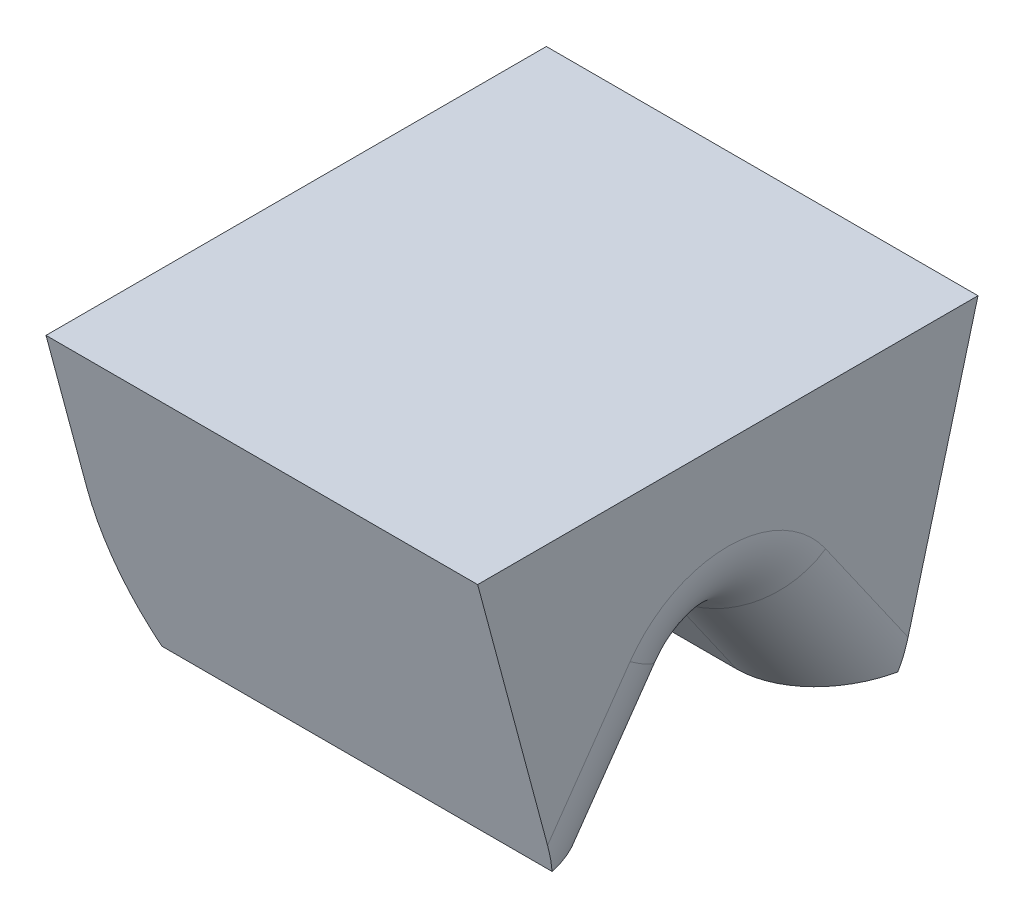
ISO-10303-21;
HEADER;
FILE_DESCRIPTION(('STEP AP214'),'2;1');
FILE_NAME('part.step','',(''),(''),'','','');
FILE_SCHEMA(('AUTOMOTIVE_DESIGN { 1 0 10303 214 1 1 1 1 }'));
ENDSEC;
DATA;
#1=APPLICATION_CONTEXT('core data for automotive mechanical design processes');
#2=APPLICATION_PROTOCOL_DEFINITION('international standard','automotive_design',2000,#1);
#3=PRODUCT_CONTEXT('',#1,'mechanical');
#4=PRODUCT('Part','Part','',(#3));
#5=PRODUCT_RELATED_PRODUCT_CATEGORY('part','',(#4));
#6=PRODUCT_DEFINITION_FORMATION('','',#4);
#7=PRODUCT_DEFINITION_CONTEXT('part definition',#1,'design');
#8=PRODUCT_DEFINITION('design','',#6,#7);
#9=PRODUCT_DEFINITION_SHAPE('','',#8);
#10=(LENGTH_UNIT() NAMED_UNIT(*) SI_UNIT(.MILLI.,.METRE.));
#11=(NAMED_UNIT(*) PLANE_ANGLE_UNIT() SI_UNIT($,.RADIAN.));
#12=(NAMED_UNIT(*) SI_UNIT($,.STERADIAN.) SOLID_ANGLE_UNIT());
#13=UNCERTAINTY_MEASURE_WITH_UNIT(LENGTH_MEASURE(1.E-05),#10,'distance_accuracy_value','');
#14=(GEOMETRIC_REPRESENTATION_CONTEXT(3) GLOBAL_UNCERTAINTY_ASSIGNED_CONTEXT((#13)) GLOBAL_UNIT_ASSIGNED_CONTEXT((#10,
#11,#12)) REPRESENTATION_CONTEXT('',''));
#15=CARTESIAN_POINT('',(0.,0.,0.));
#16=DIRECTION('',(0.,0.,1.));
#17=DIRECTION('',(1.,0.,0.));
#18=AXIS2_PLACEMENT_3D('',#15,#16,#17);
#19=CARTESIAN_POINT('',(0.,0.835526315789467,0.));
#20=DIRECTION('',(0.,1.,0.));
#21=DIRECTION('',(0.,0.,1.));
#22=AXIS2_PLACEMENT_3D('',#19,#20,#21);
#23=PLANE('',#22);
#24=DIRECTION('',(0.,0.,-1.));
#25=VECTOR('',#24,1.);
#26=CARTESIAN_POINT('',(-0.20193,0.835526315789467,2.00770998));
#27=LINE('',#26,#25);
#28=CARTESIAN_POINT('',(-0.20193,0.835526315789467,0.72425860157074));
#29=VERTEX_POINT('',#28);
#30=CARTESIAN_POINT('',(-0.20193,0.835526315789467,-0.72425860157074));
#31=VERTEX_POINT('',#30);
#32=EDGE_CURVE('E260',#29,#31,#27,.T.);
#33=ORIENTED_EDGE('',*,*,#32,.F.);
#34=DIRECTION('',(-1.,0.,0.));
#35=VECTOR('',#34,1.);
#36=CARTESIAN_POINT('',(2.00770998,0.835526315789467,0.72425860157074));
#37=LINE('',#36,#35);
#38=CARTESIAN_POINT('',(1.04775,0.835526315789467,0.72425860157074));
#39=VERTEX_POINT('',#38);
#40=EDGE_CURVE('E57',#39,#29,#37,.T.);
#41=ORIENTED_EDGE('',*,*,#40,.F.);
#42=DIRECTION('',(0.,0.,1.));
#43=VECTOR('',#42,1.);
#44=CARTESIAN_POINT('',(1.04775,0.835526315789467,2.00770998));
#45=LINE('',#44,#43);
#46=CARTESIAN_POINT('',(1.04775,0.835526315789467,-0.72425860157074));
#47=VERTEX_POINT('',#46);
#48=EDGE_CURVE('E12',#47,#39,#45,.T.);
#49=ORIENTED_EDGE('',*,*,#48,.F.);
#50=DIRECTION('',(1.,0.,0.));
#51=VECTOR('',#50,1.);
#52=CARTESIAN_POINT('',(2.00770998,0.835526315789467,-0.72425860157074));
#53=LINE('',#52,#51);
#54=EDGE_CURVE('E129',#31,#47,#53,.T.);
#55=ORIENTED_EDGE('',*,*,#54,.F.);
#56=EDGE_LOOP('',(#33,#41,#49,#55));
#57=FACE_BOUND('',#56,.T.);
#58=ADVANCED_FACE('F42',(#57),#23,.T.);
#59=CARTESIAN_POINT('',(2.00770998,0.,0.50038));
#60=DIRECTION('',(0.,-0.258819045102522,0.965925826289068));
#61=DIRECTION('',(0.,-0.965925826289068,-0.258819045102522));
#62=AXIS2_PLACEMENT_3D('',#59,#60,#61);
#63=PLANE('',#62);
#64=DIRECTION('',(0.,0.965925826289068,0.258819045102522));
#65=VECTOR('',#64,1.);
#66=CARTESIAN_POINT('',(1.04775,0.,0.50038));
#67=LINE('',#66,#65);
#68=CARTESIAN_POINT('',(1.04775,0.0803947960273653,0.521921720671197));
#69=VERTEX_POINT('',#68);
#70=EDGE_CURVE('E147',#69,#39,#67,.T.);
#71=ORIENTED_EDGE('',*,*,#70,.T.);
#72=ORIENTED_EDGE('',*,*,#40,.T.);
#73=DIRECTION('',(0.,-0.965925826289068,-0.258819045102522));
#74=VECTOR('',#73,1.);
#75=CARTESIAN_POINT('',(-0.20193,0.,0.50038));
#76=LINE('',#75,#74);
#77=CARTESIAN_POINT('',(-0.20193,0.397467402532683,0.606881069526329));
#78=VERTEX_POINT('',#77);
#79=EDGE_CURVE('E160',#29,#78,#76,.T.);
#80=ORIENTED_EDGE('',*,*,#79,.T.);
#81=CARTESIAN_POINT('',(0.29845,0.397467402532683,0.606881069526329));
#82=DIRECTION('',(0.,-0.258819045102522,0.965925826289068));
#83=DIRECTION('',(0.,-0.965925826289068,-0.258819045102522));
#84=AXIS2_PLACEMENT_3D('',#81,#82,#83);
#85=ELLIPSE('',#84,0.653199699436086,0.50038);
#86=CARTESIAN_POINT('',(-0.0901596221433995,0.,0.50038));
#87=VERTEX_POINT('',#86);
#88=EDGE_CURVE('E64',#78,#87,#85,.T.);
#89=ORIENTED_EDGE('',*,*,#88,.T.);
#90=DIRECTION('',(-1.,0.,0.));
#91=VECTOR('',#90,1.);
#92=CARTESIAN_POINT('',(2.00770998,0.,0.50038));
#93=LINE('',#92,#91);
#94=CARTESIAN_POINT('',(1.03944591681215,0.,0.50038));
#95=VERTEX_POINT('',#94);
#96=EDGE_CURVE('E162',#95,#87,#93,.T.);
#97=ORIENTED_EDGE('',*,*,#96,.F.);
#98=CARTESIAN_POINT('',(0.79883,0.0803947960273652,0.521921720671197));
#99=DIRECTION('',(0.,-0.258819045102522,0.965925826289068));
#100=DIRECTION('',(0.,0.965925826289068,0.258819045102522));
#101=AXIS2_PLACEMENT_3D('',#98,#99,#100);
#102=ELLIPSE('',#101,0.324941982460591,0.24892);
#103=EDGE_CURVE('E274',#95,#69,#102,.T.);
#104=ORIENTED_EDGE('',*,*,#103,.T.);
#105=EDGE_LOOP('',(#71,#72,#80,#89,#97,#104));
#106=FACE_BOUND('',#105,.T.);
#107=ADVANCED_FACE('F216',(#106),#63,.T.);
#108=CARTESIAN_POINT('',(2.00770998,0.,-0.50038));
#109=DIRECTION('',(0.,-0.258819045102522,-0.965925826289068));
#110=DIRECTION('',(0.,0.965925826289068,-0.258819045102522));
#111=AXIS2_PLACEMENT_3D('',#108,#109,#110);
#112=PLANE('',#111);
#113=DIRECTION('',(0.,0.965925826289068,-0.258819045102522));
#114=VECTOR('',#113,1.);
#115=CARTESIAN_POINT('',(-0.20193,0.,-0.50038));
#116=LINE('',#115,#114);
#117=CARTESIAN_POINT('',(-0.20193,0.397467402532684,-0.606881069526329));
#118=VERTEX_POINT('',#117);
#119=EDGE_CURVE('E141',#118,#31,#116,.T.);
#120=ORIENTED_EDGE('',*,*,#119,.T.);
#121=ORIENTED_EDGE('',*,*,#54,.T.);
#122=DIRECTION('',(0.,-0.965925826289068,0.258819045102522));
#123=VECTOR('',#122,1.);
#124=CARTESIAN_POINT('',(1.04775,0.,-0.50038));
#125=LINE('',#124,#123);
#126=CARTESIAN_POINT('',(1.04775,0.0803947960273655,-0.521921720671197));
#127=VERTEX_POINT('',#126);
#128=EDGE_CURVE('E138',#47,#127,#125,.T.);
#129=ORIENTED_EDGE('',*,*,#128,.T.);
#130=CARTESIAN_POINT('',(0.79883,0.0803947960273654,-0.521921720671197));
#131=DIRECTION('',(0.,-0.258819045102522,-0.965925826289068));
#132=DIRECTION('',(0.,-0.965925826289068,0.258819045102522));
#133=AXIS2_PLACEMENT_3D('',#130,#131,#132);
#134=ELLIPSE('',#133,0.324941982460591,0.24892);
#135=CARTESIAN_POINT('',(1.03944591681215,0.,-0.50038));
#136=VERTEX_POINT('',#135);
#137=EDGE_CURVE('E309',#127,#136,#134,.T.);
#138=ORIENTED_EDGE('',*,*,#137,.T.);
#139=DIRECTION('',(-1.,0.,0.));
#140=VECTOR('',#139,1.);
#141=CARTESIAN_POINT('',(2.00770998,0.,-0.50038));
#142=LINE('',#141,#140);
#143=CARTESIAN_POINT('',(-0.0901596221433991,0.,-0.50038));
#144=VERTEX_POINT('',#143);
#145=EDGE_CURVE('E164',#136,#144,#142,.T.);
#146=ORIENTED_EDGE('',*,*,#145,.T.);
#147=CARTESIAN_POINT('',(0.29845,0.397467402532683,-0.606881069526329));
#148=DIRECTION('',(0.,-0.258819045102522,-0.965925826289068));
#149=DIRECTION('',(0.,0.965925826289068,-0.258819045102522));
#150=AXIS2_PLACEMENT_3D('',#147,#148,#149);
#151=ELLIPSE('',#150,0.653199699436086,0.50038);
#152=EDGE_CURVE('E284',#144,#118,#151,.T.);
#153=ORIENTED_EDGE('',*,*,#152,.T.);
#154=EDGE_LOOP('',(#120,#121,#129,#138,#146,#153));
#155=FACE_BOUND('',#154,.T.);
#156=ADVANCED_FACE('F137',(#155),#112,.T.);
#157=CARTESIAN_POINT('',(-0.20193,1.61560002,2.00770998));
#158=DIRECTION('',(-1.,0.,0.));
#159=DIRECTION('',(0.,-1.,0.));
#160=AXIS2_PLACEMENT_3D('',#157,#158,#159);
#161=PLANE('',#160);
#162=ORIENTED_EDGE('',*,*,#79,.F.);
#163=ORIENTED_EDGE('',*,*,#32,.T.);
#164=ORIENTED_EDGE('',*,*,#119,.F.);
#165=DIRECTION('',(0.,-0.819152044288993,-0.573576436351045));
#166=VECTOR('',#165,1.);
#167=CARTESIAN_POINT('',(-0.20193,0.565887774857938,-0.4889518552361));
#168=LINE('',#167,#166);
#169=CARTESIAN_POINT('',(-0.20193,0.565887774857938,-0.4889518552361));
#170=VERTEX_POINT('',#169);
#171=EDGE_CURVE('E293',#118,#170,#168,.F.);
#172=ORIENTED_EDGE('',*,*,#171,.T.);
#173=CARTESIAN_POINT('',(-0.20193,0.22352,0.));
#174=DIRECTION('',(-1.,0.,0.));
#175=DIRECTION('',(0.,-1.,0.));
#176=AXIS2_PLACEMENT_3D('',#173,#174,#175);
#177=CIRCLE('',#176,0.5969);
#178=CARTESIAN_POINT('',(-0.20193,0.565887774857938,0.4889518552361));
#179=VERTEX_POINT('',#178);
#180=EDGE_CURVE('E291',#170,#179,#177,.F.);
#181=ORIENTED_EDGE('',*,*,#180,.T.);
#182=DIRECTION('',(0.,0.819152044288993,-0.573576436351045));
#183=VECTOR('',#182,1.);
#184=CARTESIAN_POINT('',(-0.20193,0.287006177221336,0.684226852169215));
#185=LINE('',#184,#183);
#186=EDGE_CURVE('E288',#179,#78,#185,.F.);
#187=ORIENTED_EDGE('',*,*,#186,.T.);
#188=EDGE_LOOP('',(#162,#163,#164,#172,#181,#187));
#189=FACE_BOUND('',#188,.T.);
#190=ADVANCED_FACE('F343',(#189),#161,.T.);
#191=CARTESIAN_POINT('',(1.04775,-0.00999998,2.00770998));
#192=DIRECTION('',(1.,0.,0.));
#193=DIRECTION('',(0.,0.,-1.));
#194=AXIS2_PLACEMENT_3D('',#191,#192,#193);
#195=PLANE('',#194);
#196=ORIENTED_EDGE('',*,*,#128,.F.);
#197=ORIENTED_EDGE('',*,*,#48,.T.);
#198=ORIENTED_EDGE('',*,*,#70,.F.);
#199=DIRECTION('',(0.,-0.819152044288993,0.573576436351045));
#200=VECTOR('',#199,1.);
#201=CARTESIAN_POINT('',(1.04775,0.421656244173105,0.282967882179189));
#202=LINE('',#201,#200);
#203=CARTESIAN_POINT('',(1.04775,0.421656244173105,0.28296788217919));
#204=VERTEX_POINT('',#203);
#205=EDGE_CURVE('E330',#69,#204,#202,.F.);
#206=ORIENTED_EDGE('',*,*,#205,.T.);
#207=CARTESIAN_POINT('',(1.04775,0.22352,0.));
#208=DIRECTION('',(1.,0.,0.));
#209=DIRECTION('',(0.,0.,-1.));
#210=AXIS2_PLACEMENT_3D('',#207,#208,#209);
#211=CIRCLE('',#210,0.34544);
#212=CARTESIAN_POINT('',(1.04775,0.421656244173105,-0.28296788217919));
#213=VERTEX_POINT('',#212);
#214=EDGE_CURVE('E314',#204,#213,#211,.F.);
#215=ORIENTED_EDGE('',*,*,#214,.T.);
#216=DIRECTION('',(0.,0.819152044288993,0.573576436351045));
#217=VECTOR('',#216,1.);
#218=CARTESIAN_POINT('',(1.04775,0.142774646536502,-0.478242879112305));
#219=LINE('',#218,#217);
#220=EDGE_CURVE('E145',#213,#127,#219,.F.);
#221=ORIENTED_EDGE('',*,*,#220,.T.);
#222=EDGE_LOOP('',(#196,#197,#198,#206,#215,#221));
#223=FACE_BOUND('',#222,.T.);
#224=ADVANCED_FACE('F143',(#223),#195,.T.);
#225=CARTESIAN_POINT('',(0.,0.,0.));
#226=DIRECTION('',(0.,1.,0.));
#227=DIRECTION('',(0.,0.,1.));
#228=AXIS2_PLACEMENT_3D('',#225,#226,#227);
#229=PLANE('',#228);
#230=CARTESIAN_POINT('',(0.79883,0.,-0.274339552247889));
#231=DIRECTION('',(-1.,0.,0.));
#232=VECTOR('',#231,1.);
#233=LINE('',#230,#232);
#234=CARTESIAN_POINT('',(0.79883,0.,-0.274339552247889));
#235=VERTEX_POINT('',#234);
#236=CARTESIAN_POINT('',(0.29845,0.,-0.274339552247889));
#237=VERTEX_POINT('',#236);
#238=EDGE_CURVE('E308',#235,#237,#233,.T.);
#239=ORIENTED_EDGE('',*,*,#238,.T.);
#240=CARTESIAN_POINT('',(0.29845,0.,-0.885190740972346));
#241=DIRECTION('',(0.,1.,0.));
#242=DIRECTION('',(0.,0.,1.));
#243=AXIS2_PLACEMENT_3D('',#240,#241,#242);
#244=ELLIPSE('',#243,0.610851188724457,0.50038);
#245=EDGE_CURVE('E280',#237,#144,#244,.F.);
#246=ORIENTED_EDGE('',*,*,#245,.T.);
#247=ORIENTED_EDGE('',*,*,#145,.F.);
#248=CARTESIAN_POINT('',(0.79883,0.,-0.578214762882391));
#249=DIRECTION('',(0.,1.,0.));
#250=DIRECTION('',(0.,0.,-1.));
#251=AXIS2_PLACEMENT_3D('',#248,#249,#250);
#252=ELLIPSE('',#251,0.303875210634501,0.24892);
#253=EDGE_CURVE('E310',#136,#235,#252,.F.);
#254=ORIENTED_EDGE('',*,*,#253,.T.);
#255=EDGE_LOOP('',(#239,#246,#247,#254));
#256=FACE_BOUND('',#255,.T.);
#257=ADVANCED_FACE('F187',(#256),#229,.F.);
#258=ORIENTED_EDGE('',*,*,#96,.T.);
#259=CARTESIAN_POINT('',(0.29845,0.,0.885190740972345));
#260=DIRECTION('',(0.,1.,0.));
#261=DIRECTION('',(0.,0.,1.));
#262=AXIS2_PLACEMENT_3D('',#259,#260,#261);
#263=ELLIPSE('',#262,0.610851188724456,0.50038);
#264=CARTESIAN_POINT('',(0.29845,0.,0.274339552247889));
#265=VERTEX_POINT('',#264);
#266=EDGE_CURVE('E50',#87,#265,#263,.F.);
#267=ORIENTED_EDGE('',*,*,#266,.T.);
#268=CARTESIAN_POINT('',(0.29845,0.,0.274339552247889));
#269=DIRECTION('',(1.,0.,0.));
#270=VECTOR('',#269,1.);
#271=LINE('',#268,#270);
#272=CARTESIAN_POINT('',(0.79883,0.,0.274339552247889));
#273=VERTEX_POINT('',#272);
#274=EDGE_CURVE('E167',#265,#273,#271,.T.);
#275=ORIENTED_EDGE('',*,*,#274,.T.);
#276=CARTESIAN_POINT('',(0.79883,0.,0.57821476288239));
#277=DIRECTION('',(0.,1.,0.));
#278=DIRECTION('',(0.,0.,-1.));
#279=AXIS2_PLACEMENT_3D('',#276,#277,#278);
#280=ELLIPSE('',#279,0.303875210634501,0.24892);
#281=EDGE_CURVE('E323',#273,#95,#280,.F.);
#282=ORIENTED_EDGE('',*,*,#281,.T.);
#283=EDGE_LOOP('',(#258,#267,#275,#282));
#284=FACE_BOUND('',#283,.T.);
#285=ADVANCED_FACE('F176',(#284),#229,.F.);
#286=CARTESIAN_POINT('',(-1.60147,0.278881597636603,-0.0790645553147735));
#287=DIRECTION('',(0.,0.573576436351045,-0.819152044288993));
#288=DIRECTION('',(0.,0.819152044288993,0.573576436351045));
#289=AXIS2_PLACEMENT_3D('',#286,#287,#288);
#290=PLANE('',#289);
#291=DIRECTION('',(1.,0.,0.));
#292=VECTOR('',#291,1.);
#293=CARTESIAN_POINT('',(-1.60147,0.278881597636603,-0.0790645553147735));
#294=LINE('',#293,#292);
#295=CARTESIAN_POINT('',(0.29845,0.278881597636603,-0.0790645553147735));
#296=VERTEX_POINT('',#295);
#297=CARTESIAN_POINT('',(0.79883,0.278881597636603,-0.0790645553147735));
#298=VERTEX_POINT('',#297);
#299=EDGE_CURVE('E151',#296,#298,#294,.T.);
#300=ORIENTED_EDGE('',*,*,#299,.F.);
#301=DIRECTION('',(0.,-0.819152044288993,-0.573576436351045));
#302=VECTOR('',#301,1.);
#303=CARTESIAN_POINT('',(0.29845,0.,-0.274339552247889));
#304=LINE('',#303,#302);
#305=EDGE_CURVE('E277',#296,#237,#304,.T.);
#306=ORIENTED_EDGE('',*,*,#305,.T.);
#307=ORIENTED_EDGE('',*,*,#238,.F.);
#308=DIRECTION('',(0.,0.819152044288993,0.573576436351045));
#309=VECTOR('',#308,1.);
#310=CARTESIAN_POINT('',(0.79883,0.278881597636603,-0.0790645553147735));
#311=LINE('',#310,#309);
#312=EDGE_CURVE('E302',#235,#298,#311,.T.);
#313=ORIENTED_EDGE('',*,*,#312,.T.);
#314=EDGE_LOOP('',(#300,#306,#307,#313));
#315=FACE_BOUND('',#314,.T.);
#316=ADVANCED_FACE('F186',(#315),#290,.F.);
#317=CARTESIAN_POINT('',(-1.60147,-0.00999998000000014,0.281341613625836));
#318=DIRECTION('',(0.,0.573576436351044,0.819152044288993));
#319=DIRECTION('',(0.,-0.819152044288993,0.573576436351045));
#320=AXIS2_PLACEMENT_3D('',#317,#318,#319);
#321=PLANE('',#320);
#322=ORIENTED_EDGE('',*,*,#274,.F.);
#323=DIRECTION('',(0.,0.819152044288993,-0.573576436351045));
#324=VECTOR('',#323,1.);
#325=CARTESIAN_POINT('',(0.29845,0.278881597636603,0.0790645553147733));
#326=LINE('',#325,#324);
#327=CARTESIAN_POINT('',(0.29845,0.278881597636603,0.0790645553147736));
#328=VERTEX_POINT('',#327);
#329=EDGE_CURVE('E248',#265,#328,#326,.T.);
#330=ORIENTED_EDGE('',*,*,#329,.T.);
#331=DIRECTION('',(1.,0.,0.));
#332=VECTOR('',#331,1.);
#333=CARTESIAN_POINT('',(-1.60147,0.278881597636603,0.0790645553147736));
#334=LINE('',#333,#332);
#335=CARTESIAN_POINT('',(0.79883,0.278881597636603,0.0790645553147736));
#336=VERTEX_POINT('',#335);
#337=EDGE_CURVE('E148',#328,#336,#334,.T.);
#338=ORIENTED_EDGE('',*,*,#337,.T.);
#339=DIRECTION('',(0.,-0.819152044288993,0.573576436351045));
#340=VECTOR('',#339,1.);
#341=CARTESIAN_POINT('',(0.79883,0.,0.274339552247889));
#342=LINE('',#341,#340);
#343=EDGE_CURVE('E321',#336,#273,#342,.T.);
#344=ORIENTED_EDGE('',*,*,#343,.T.);
#345=EDGE_LOOP('',(#322,#330,#338,#344));
#346=FACE_BOUND('',#345,.T.);
#347=ADVANCED_FACE('F224',(#346),#321,.F.);
#348=CARTESIAN_POINT('',(-1.60147,0.22352,0.));
#349=DIRECTION('',(1.,0.,0.));
#350=DIRECTION('',(0.,0.,-1.));
#351=AXIS2_PLACEMENT_3D('',#348,#349,#350);
#352=CYLINDRICAL_SURFACE('',#351,0.0965199999999999);
#353=ORIENTED_EDGE('',*,*,#337,.F.);
#354=CARTESIAN_POINT('',(0.29845,0.22352,0.));
#355=DIRECTION('',(-1.,0.,0.));
#356=DIRECTION('',(0.,-1.,0.));
#357=AXIS2_PLACEMENT_3D('',#354,#355,#356);
#358=CIRCLE('',#357,0.0965199999999999);
#359=EDGE_CURVE('E250',#328,#296,#358,.T.);
#360=ORIENTED_EDGE('',*,*,#359,.T.);
#361=ORIENTED_EDGE('',*,*,#299,.T.);
#362=CARTESIAN_POINT('',(0.79883,0.22352,0.));
#363=DIRECTION('',(1.,0.,0.));
#364=DIRECTION('',(0.,0.,-1.));
#365=AXIS2_PLACEMENT_3D('',#362,#363,#364);
#366=CIRCLE('',#365,0.0965199999999999);
#367=EDGE_CURVE('E312',#298,#336,#366,.T.);
#368=ORIENTED_EDGE('',*,*,#367,.T.);
#369=EDGE_LOOP('',(#353,#360,#361,#368));
#370=FACE_BOUND('',#369,.T.);
#371=ADVANCED_FACE('F202',(#370),#352,.F.);
#372=CARTESIAN_POINT('',(0.79883,0.132774666536502,0.485244940490252));
#373=DIRECTION('',(0.,0.819152044288993,-0.573576436351045));
#374=DIRECTION('',(0.,0.573576436351045,0.819152044288993));
#375=AXIS2_PLACEMENT_3D('',#372,#373,#374);
#376=CYLINDRICAL_SURFACE('',#375,0.24892);
#377=ORIENTED_EDGE('',*,*,#281,.F.);
#378=ORIENTED_EDGE('',*,*,#343,.F.);
#379=CARTESIAN_POINT('',(0.79883,0.421656244173105,0.28296788217919));
#380=DIRECTION('',(0.,0.819152044288993,-0.573576436351044));
#381=DIRECTION('',(0.,0.573576436351044,0.819152044288993));
#382=AXIS2_PLACEMENT_3D('',#379,#380,#381);
#383=CIRCLE('',#382,0.24892);
#384=EDGE_CURVE('E266',#204,#336,#383,.T.);
#385=ORIENTED_EDGE('',*,*,#384,.F.);
#386=ORIENTED_EDGE('',*,*,#205,.F.);
#387=ORIENTED_EDGE('',*,*,#103,.F.);
#388=EDGE_LOOP('',(#377,#378,#385,#386,#387));
#389=FACE_BOUND('',#388,.T.);
#390=ADVANCED_FACE('F198',(#389),#376,.T.);
#391=CARTESIAN_POINT('',(0.79883,0.22352,0.));
#392=DIRECTION('',(1.,0.,0.));
#393=DIRECTION('',(0.,0.,-1.));
#394=AXIS2_PLACEMENT_3D('',#391,#392,#393);
#395=TOROIDAL_SURFACE('',#394,0.34544,0.24892);
#396=ORIENTED_EDGE('',*,*,#384,.T.);
#397=ORIENTED_EDGE('',*,*,#367,.F.);
#398=CARTESIAN_POINT('',(0.79883,0.421656244173105,-0.28296788217919));
#399=DIRECTION('',(0.,-0.819152044288993,-0.573576436351045));
#400=DIRECTION('',(0.,0.573576436351045,-0.819152044288993));
#401=AXIS2_PLACEMENT_3D('',#398,#399,#400);
#402=CIRCLE('',#401,0.24892);
#403=EDGE_CURVE('E261',#213,#298,#402,.T.);
#404=ORIENTED_EDGE('',*,*,#403,.F.);
#405=ORIENTED_EDGE('',*,*,#214,.F.);
#406=EDGE_LOOP('',(#396,#397,#404,#405));
#407=FACE_BOUND('',#406,.T.);
#408=ADVANCED_FACE('F194',(#407),#395,.T.);
#409=CARTESIAN_POINT('',(0.79883,0.421656244173105,-0.28296788217919));
#410=DIRECTION('',(0.,-0.819152044288993,-0.573576436351045));
#411=DIRECTION('',(0.,0.573576436351045,-0.819152044288993));
#412=AXIS2_PLACEMENT_3D('',#409,#410,#411);
#413=CYLINDRICAL_SURFACE('',#412,0.24892);
#414=ORIENTED_EDGE('',*,*,#137,.F.);
#415=ORIENTED_EDGE('',*,*,#220,.F.);
#416=ORIENTED_EDGE('',*,*,#403,.T.);
#417=ORIENTED_EDGE('',*,*,#312,.F.);
#418=ORIENTED_EDGE('',*,*,#253,.F.);
#419=EDGE_LOOP('',(#414,#415,#416,#417,#418));
#420=FACE_BOUND('',#419,.T.);
#421=ADVANCED_FACE('F190',(#420),#413,.T.);
#422=CARTESIAN_POINT('',(0.29845,0.277006197221336,0.691228913547162));
#423=DIRECTION('',(0.,-0.819152044288993,0.573576436351045));
#424=DIRECTION('',(0.,-0.573576436351045,-0.819152044288993));
#425=AXIS2_PLACEMENT_3D('',#422,#423,#424);
#426=CYLINDRICAL_SURFACE('',#425,0.50038);
#427=ORIENTED_EDGE('',*,*,#88,.F.);
#428=ORIENTED_EDGE('',*,*,#186,.F.);
#429=CARTESIAN_POINT('',(0.29845,0.565887774857938,0.4889518552361));
#430=DIRECTION('',(0.,0.819152044288993,-0.573576436351045));
#431=DIRECTION('',(0.,0.573576436351045,0.819152044288993));
#432=AXIS2_PLACEMENT_3D('',#429,#430,#431);
#433=CIRCLE('',#432,0.50038);
#434=EDGE_CURVE('E259',#328,#179,#433,.T.);
#435=ORIENTED_EDGE('',*,*,#434,.F.);
#436=ORIENTED_EDGE('',*,*,#329,.F.);
#437=ORIENTED_EDGE('',*,*,#266,.F.);
#438=EDGE_LOOP('',(#427,#428,#435,#436,#437));
#439=FACE_BOUND('',#438,.T.);
#440=ADVANCED_FACE('F44',(#439),#426,.T.);
#441=CARTESIAN_POINT('',(0.29845,0.22352,0.));
#442=DIRECTION('',(-1.,0.,0.));
#443=DIRECTION('',(0.,-1.,0.));
#444=AXIS2_PLACEMENT_3D('',#441,#442,#443);
#445=TOROIDAL_SURFACE('',#444,0.5969,0.50038);
#446=ORIENTED_EDGE('',*,*,#434,.T.);
#447=ORIENTED_EDGE('',*,*,#180,.F.);
#448=CARTESIAN_POINT('',(0.29845,0.565887774857938,-0.4889518552361));
#449=DIRECTION('',(0.,-0.819152044288993,-0.573576436351044));
#450=DIRECTION('',(0.,0.573576436351044,-0.819152044288993));
#451=AXIS2_PLACEMENT_3D('',#448,#449,#450);
#452=CIRCLE('',#451,0.50038);
#453=EDGE_CURVE('E257',#296,#170,#452,.T.);
#454=ORIENTED_EDGE('',*,*,#453,.F.);
#455=ORIENTED_EDGE('',*,*,#359,.F.);
#456=EDGE_LOOP('',(#446,#447,#454,#455));
#457=FACE_BOUND('',#456,.T.);
#458=ADVANCED_FACE('F206',(#457),#445,.T.);
#459=CARTESIAN_POINT('',(0.29845,0.565887774857939,-0.4889518552361));
#460=DIRECTION('',(0.,0.819152044288993,0.573576436351045));
#461=DIRECTION('',(0.,-0.573576436351045,0.819152044288993));
#462=AXIS2_PLACEMENT_3D('',#459,#460,#461);
#463=CYLINDRICAL_SURFACE('',#462,0.50038);
#464=ORIENTED_EDGE('',*,*,#453,.T.);
#465=ORIENTED_EDGE('',*,*,#171,.F.);
#466=ORIENTED_EDGE('',*,*,#152,.F.);
#467=ORIENTED_EDGE('',*,*,#245,.F.);
#468=ORIENTED_EDGE('',*,*,#305,.F.);
#469=EDGE_LOOP('',(#464,#465,#466,#467,#468));
#470=FACE_BOUND('',#469,.T.);
#471=ADVANCED_FACE('F204',(#470),#463,.T.);
#472=CLOSED_SHELL('',(#58,#107,#156,#190,#224,#257,#285,#316,#347,#371,#390,#408,#421,#440,#458,#471));
#473=MANIFOLD_SOLID_BREP('B2',#472);
#474=ADVANCED_BREP_SHAPE_REPRESENTATION('',(#18,#473),#14);
#475=SHAPE_DEFINITION_REPRESENTATION(#9,#474);
ENDSEC;
END-ISO-10303-21;
